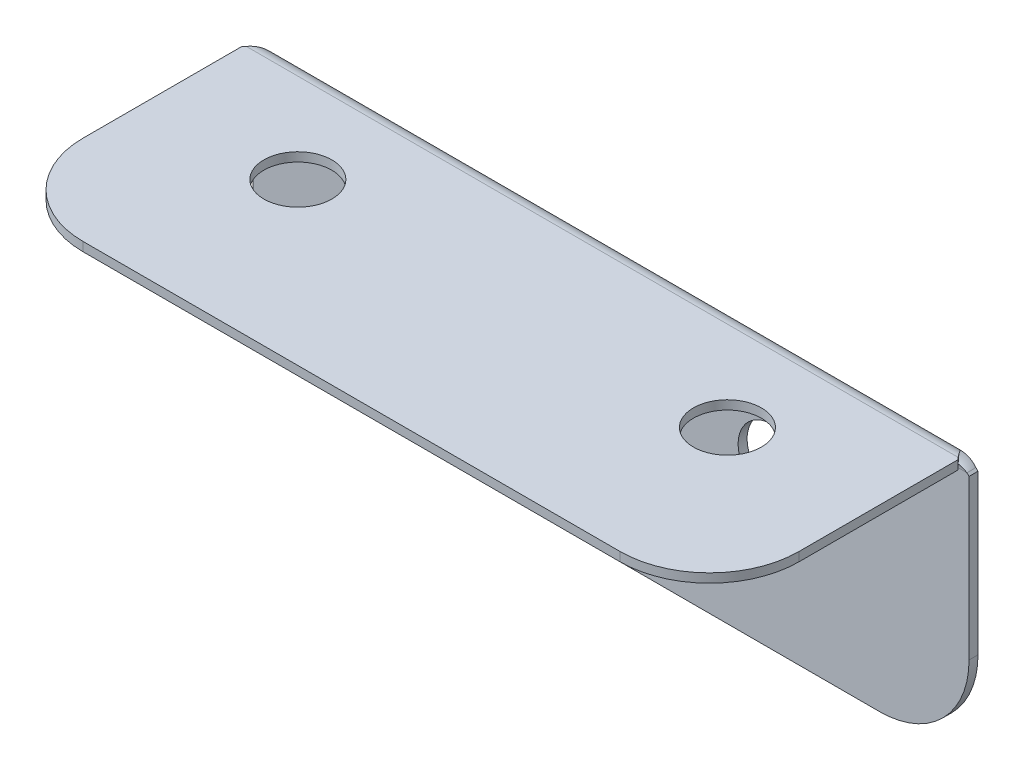
ISO-10303-21;
HEADER;
FILE_DESCRIPTION(('STEP AP214'),'2;1');
FILE_NAME('part.step','',(''),(''),'','','');
FILE_SCHEMA(('AUTOMOTIVE_DESIGN { 1 0 10303 214 1 1 1 1 }'));
ENDSEC;
DATA;
#1=APPLICATION_CONTEXT('core data for automotive mechanical design processes');
#2=APPLICATION_PROTOCOL_DEFINITION('international standard','automotive_design',2000,#1);
#3=PRODUCT_CONTEXT('',#1,'mechanical');
#4=PRODUCT('Part','Part','',(#3));
#5=PRODUCT_RELATED_PRODUCT_CATEGORY('part','',(#4));
#6=PRODUCT_DEFINITION_FORMATION('','',#4);
#7=PRODUCT_DEFINITION_CONTEXT('part definition',#1,'design');
#8=PRODUCT_DEFINITION('design','',#6,#7);
#9=PRODUCT_DEFINITION_SHAPE('','',#8);
#10=(LENGTH_UNIT() NAMED_UNIT(*) SI_UNIT(.MILLI.,.METRE.));
#11=(NAMED_UNIT(*) PLANE_ANGLE_UNIT() SI_UNIT($,.RADIAN.));
#12=(NAMED_UNIT(*) SI_UNIT($,.STERADIAN.) SOLID_ANGLE_UNIT());
#13=UNCERTAINTY_MEASURE_WITH_UNIT(LENGTH_MEASURE(1.E-05),#10,'distance_accuracy_value','');
#14=(GEOMETRIC_REPRESENTATION_CONTEXT(3) GLOBAL_UNCERTAINTY_ASSIGNED_CONTEXT((#13)) GLOBAL_UNIT_ASSIGNED_CONTEXT((#10,
#11,#12)) REPRESENTATION_CONTEXT('',''));
#15=CARTESIAN_POINT('',(0.,0.,0.));
#16=DIRECTION('',(0.,0.,1.));
#17=DIRECTION('',(1.,0.,0.));
#18=AXIS2_PLACEMENT_3D('',#15,#16,#17);
#19=CARTESIAN_POINT('',(20.,-0.500000000000006,-9.99999999999999));
#20=DIRECTION('',(1.,0.,0.));
#21=DIRECTION('',(0.,0.,-1.));
#22=AXIS2_PLACEMENT_3D('',#19,#20,#21);
#23=PLANE('',#22);
#24=DIRECTION('',(0.,-1.,0.));
#25=VECTOR('',#24,1.);
#26=CARTESIAN_POINT('',(20.,0.00100000000004263,-8.88194184136153));
#27=LINE('',#26,#25);
#28=CARTESIAN_POINT('',(20.,0.,-8.88194184136153));
#29=VERTEX_POINT('',#28);
#30=CARTESIAN_POINT('',(20.,-0.500000000000009,-8.88194184136153));
#31=VERTEX_POINT('',#30);
#32=EDGE_CURVE('E562',#29,#31,#27,.T.);
#33=ORIENTED_EDGE('',*,*,#32,.F.);
#34=DIRECTION('',(0.,0.,-1.));
#35=VECTOR('',#34,1.);
#36=CARTESIAN_POINT('',(20.,0.,-9.99999999999999));
#37=LINE('',#36,#35);
#38=CARTESIAN_POINT('',(20.,0.,0.));
#39=VERTEX_POINT('',#38);
#40=EDGE_CURVE('E581',#39,#29,#37,.T.);
#41=ORIENTED_EDGE('',*,*,#40,.F.);
#42=DIRECTION('',(0.,1.,0.));
#43=VECTOR('',#42,1.);
#44=CARTESIAN_POINT('',(20.,-0.500000000000006,0.));
#45=LINE('',#44,#43);
#46=CARTESIAN_POINT('',(20.,-0.500000000000006,0.));
#47=VERTEX_POINT('',#46);
#48=EDGE_CURVE('E609',#39,#47,#45,.F.);
#49=ORIENTED_EDGE('',*,*,#48,.T.);
#50=DIRECTION('',(0.,0.,-1.));
#51=VECTOR('',#50,1.);
#52=CARTESIAN_POINT('',(20.,-0.500000000000006,-9.99999999999999));
#53=LINE('',#52,#51);
#54=EDGE_CURVE('E584',#47,#31,#53,.T.);
#55=ORIENTED_EDGE('',*,*,#54,.T.);
#56=EDGE_LOOP('',(#33,#41,#49,#55));
#57=FACE_BOUND('',#56,.T.);
#58=ADVANCED_FACE('F84',(#57),#23,.T.);
#59=CARTESIAN_POINT('',(0.,-0.500000000000006,0.));
#60=DIRECTION('',(0.,1.,0.));
#61=DIRECTION('',(0.,0.,1.));
#62=AXIS2_PLACEMENT_3D('',#59,#60,#61);
#63=PLANE('',#62);
#64=CARTESIAN_POINT('',(12.,-0.500000000000006,-3.99999999999999));
#65=DIRECTION('',(0.,1.,0.));
#66=DIRECTION('',(0.,0.,1.));
#67=AXIS2_PLACEMENT_3D('',#64,#65,#66);
#68=CIRCLE('',#67,1.89864999999999);
#69=CARTESIAN_POINT('',(12.,-0.500000000000006,-2.10135));
#70=VERTEX_POINT('',#69);
#71=EDGE_CURVE('E568',#70,#70,#68,.T.);
#72=ORIENTED_EDGE('',*,*,#71,.T.);
#73=EDGE_LOOP('',(#72));
#74=FACE_BOUND('',#73,.T.);
#75=CARTESIAN_POINT('',(-12.,-0.500000000000006,-3.99999999999999));
#76=DIRECTION('',(0.,1.,0.));
#77=DIRECTION('',(0.,0.,1.));
#78=AXIS2_PLACEMENT_3D('',#75,#76,#77);
#79=CIRCLE('',#78,1.89864999999999);
#80=CARTESIAN_POINT('',(-12.,-0.500000000000006,-2.10135));
#81=VERTEX_POINT('',#80);
#82=EDGE_CURVE('E574',#81,#81,#79,.T.);
#83=ORIENTED_EDGE('',*,*,#82,.T.);
#84=EDGE_LOOP('',(#83));
#85=FACE_BOUND('',#84,.T.);
#86=DIRECTION('',(0.,0.,1.));
#87=VECTOR('',#86,1.);
#88=CARTESIAN_POINT('',(-20.,-0.500000000000006,-9.99999999999999));
#89=LINE('',#88,#87);
#90=CARTESIAN_POINT('',(-20.,-0.500000000000009,-8.88194184136153));
#91=VERTEX_POINT('',#90);
#92=CARTESIAN_POINT('',(-20.,-0.500000000000006,0.));
#93=VERTEX_POINT('',#92);
#94=EDGE_CURVE('E578',#91,#93,#89,.T.);
#95=ORIENTED_EDGE('',*,*,#94,.F.);
#96=DIRECTION('',(-0.70710678118655,0.,0.707106781186545));
#97=VECTOR('',#96,1.);
#98=CARTESIAN_POINT('',(-20.,-0.500000000000009,-8.88194184136153));
#99=LINE('',#98,#97);
#100=CARTESIAN_POINT('',(-19.8819418413615,-0.500000000000007,-9.));
#101=VERTEX_POINT('',#100);
#102=EDGE_CURVE('E561',#101,#91,#99,.T.);
#103=ORIENTED_EDGE('',*,*,#102,.F.);
#104=DIRECTION('',(-1.,0.,0.));
#105=VECTOR('',#104,1.);
#106=CARTESIAN_POINT('',(20.,-0.500000000000007,-8.99999999999999));
#107=LINE('',#106,#105);
#108=CARTESIAN_POINT('',(19.8819418413615,-0.500000000000001,-9.));
#109=VERTEX_POINT('',#108);
#110=EDGE_CURVE('E240',#109,#101,#107,.T.);
#111=ORIENTED_EDGE('',*,*,#110,.F.);
#112=DIRECTION('',(-0.707106781186546,0.,-0.707106781186549));
#113=VECTOR('',#112,1.);
#114=CARTESIAN_POINT('',(20.,-0.500000000000009,-8.88194184136153));
#115=LINE('',#114,#113);
#116=EDGE_CURVE('E564',#31,#109,#115,.T.);
#117=ORIENTED_EDGE('',*,*,#116,.F.);
#118=ORIENTED_EDGE('',*,*,#54,.F.);
#119=CARTESIAN_POINT('',(15.,-0.500000000000006,0.));
#120=DIRECTION('',(0.,1.,0.));
#121=DIRECTION('',(0.,0.,1.));
#122=AXIS2_PLACEMENT_3D('',#119,#120,#121);
#123=CIRCLE('',#122,5.);
#124=CARTESIAN_POINT('',(15.,-0.500000000000007,5.00000000000001));
#125=VERTEX_POINT('',#124);
#126=EDGE_CURVE('E604',#47,#125,#123,.F.);
#127=ORIENTED_EDGE('',*,*,#126,.T.);
#128=DIRECTION('',(1.,0.,0.));
#129=VECTOR('',#128,1.);
#130=CARTESIAN_POINT('',(-20.,-0.500000000000007,5.00000000000001));
#131=LINE('',#130,#129);
#132=CARTESIAN_POINT('',(-15.,-0.500000000000007,5.00000000000001));
#133=VERTEX_POINT('',#132);
#134=EDGE_CURVE('E580',#133,#125,#131,.T.);
#135=ORIENTED_EDGE('',*,*,#134,.F.);
#136=CARTESIAN_POINT('',(-15.,-0.500000000000006,0.));
#137=DIRECTION('',(0.,1.,0.));
#138=DIRECTION('',(0.,0.,1.));
#139=AXIS2_PLACEMENT_3D('',#136,#137,#138);
#140=CIRCLE('',#139,5.);
#141=EDGE_CURVE('E606',#133,#93,#140,.F.);
#142=ORIENTED_EDGE('',*,*,#141,.T.);
#143=EDGE_LOOP('',(#95,#103,#111,#117,#118,#127,#135,#142));
#144=FACE_BOUND('',#143,.T.);
#145=ADVANCED_FACE('F668',(#74,#85,#144),#63,.F.);
#146=CARTESIAN_POINT('',(0.,0.,0.));
#147=DIRECTION('',(0.,1.,0.));
#148=DIRECTION('',(0.,0.,1.));
#149=AXIS2_PLACEMENT_3D('',#146,#147,#148);
#150=PLANE('',#149);
#151=DIRECTION('',(-0.70710678118655,0.,0.707106781186545));
#152=VECTOR('',#151,1.);
#153=CARTESIAN_POINT('',(-20.,0.,-8.88194184136153));
#154=LINE('',#153,#152);
#155=CARTESIAN_POINT('',(-19.8819418413615,0.,-8.99999999999999));
#156=VERTEX_POINT('',#155);
#157=CARTESIAN_POINT('',(-20.,0.,-8.88194184136153));
#158=VERTEX_POINT('',#157);
#159=EDGE_CURVE('E109',#156,#158,#154,.T.);
#160=ORIENTED_EDGE('',*,*,#159,.T.);
#161=DIRECTION('',(0.,0.,1.));
#162=VECTOR('',#161,1.);
#163=CARTESIAN_POINT('',(-20.,0.,-9.99999999999999));
#164=LINE('',#163,#162);
#165=CARTESIAN_POINT('',(-20.,0.,0.));
#166=VERTEX_POINT('',#165);
#167=EDGE_CURVE('E577',#158,#166,#164,.T.);
#168=ORIENTED_EDGE('',*,*,#167,.T.);
#169=CARTESIAN_POINT('',(-15.,0.,0.));
#170=DIRECTION('',(0.,1.,0.));
#171=DIRECTION('',(0.,0.,1.));
#172=AXIS2_PLACEMENT_3D('',#169,#170,#171);
#173=CIRCLE('',#172,5.);
#174=CARTESIAN_POINT('',(-15.,0.,5.00000000000001));
#175=VERTEX_POINT('',#174);
#176=EDGE_CURVE('E597',#166,#175,#173,.T.);
#177=ORIENTED_EDGE('',*,*,#176,.T.);
#178=DIRECTION('',(1.,0.,0.));
#179=VECTOR('',#178,1.);
#180=CARTESIAN_POINT('',(-20.,0.,5.00000000000001));
#181=LINE('',#180,#179);
#182=CARTESIAN_POINT('',(15.,0.,5.00000000000001));
#183=VERTEX_POINT('',#182);
#184=EDGE_CURVE('E589',#175,#183,#181,.T.);
#185=ORIENTED_EDGE('',*,*,#184,.T.);
#186=CARTESIAN_POINT('',(15.,0.,0.));
#187=DIRECTION('',(0.,1.,0.));
#188=DIRECTION('',(0.,0.,1.));
#189=AXIS2_PLACEMENT_3D('',#186,#187,#188);
#190=CIRCLE('',#189,5.);
#191=EDGE_CURVE('E595',#183,#39,#190,.T.);
#192=ORIENTED_EDGE('',*,*,#191,.T.);
#193=ORIENTED_EDGE('',*,*,#40,.T.);
#194=DIRECTION('',(-0.707106781186546,0.,-0.707106781186549));
#195=VECTOR('',#194,1.);
#196=CARTESIAN_POINT('',(20.,0.,-8.88194184136153));
#197=LINE('',#196,#195);
#198=CARTESIAN_POINT('',(19.8819418413615,0.,-8.99999999999999));
#199=VERTEX_POINT('',#198);
#200=EDGE_CURVE('E101',#29,#199,#197,.T.);
#201=ORIENTED_EDGE('',*,*,#200,.T.);
#202=DIRECTION('',(-1.,0.,0.));
#203=VECTOR('',#202,1.);
#204=CARTESIAN_POINT('',(20.,0.,-8.99999999999999));
#205=LINE('',#204,#203);
#206=EDGE_CURVE('E94',#199,#156,#205,.T.);
#207=ORIENTED_EDGE('',*,*,#206,.T.);
#208=EDGE_LOOP('',(#160,#168,#177,#185,#192,#193,#201,#207));
#209=FACE_BOUND('',#208,.T.);
#210=CARTESIAN_POINT('',(12.,0.,-3.99999999999999));
#211=DIRECTION('',(0.,1.,0.));
#212=DIRECTION('',(0.,0.,1.));
#213=AXIS2_PLACEMENT_3D('',#210,#211,#212);
#214=CIRCLE('',#213,1.89864999999999);
#215=CARTESIAN_POINT('',(12.,0.,-2.10135000000001));
#216=VERTEX_POINT('',#215);
#217=EDGE_CURVE('E565',#216,#216,#214,.T.);
#218=ORIENTED_EDGE('',*,*,#217,.F.);
#219=EDGE_LOOP('',(#218));
#220=FACE_BOUND('',#219,.T.);
#221=CARTESIAN_POINT('',(-12.,0.,-3.99999999999999));
#222=DIRECTION('',(0.,1.,0.));
#223=DIRECTION('',(0.,0.,1.));
#224=AXIS2_PLACEMENT_3D('',#221,#222,#223);
#225=CIRCLE('',#224,1.89864999999999);
#226=CARTESIAN_POINT('',(-12.,0.,-2.10135000000001));
#227=VERTEX_POINT('',#226);
#228=EDGE_CURVE('E571',#227,#227,#225,.T.);
#229=ORIENTED_EDGE('',*,*,#228,.F.);
#230=EDGE_LOOP('',(#229));
#231=FACE_BOUND('',#230,.T.);
#232=ADVANCED_FACE('F660',(#209,#220,#231),#150,.T.);
#233=CARTESIAN_POINT('',(-20.,-0.500000000000006,-9.99999999999999));
#234=DIRECTION('',(-1.,0.,0.));
#235=DIRECTION('',(0.,0.,1.));
#236=AXIS2_PLACEMENT_3D('',#233,#234,#235);
#237=PLANE('',#236);
#238=DIRECTION('',(0.,-1.,0.));
#239=VECTOR('',#238,1.);
#240=CARTESIAN_POINT('',(-20.,0.00100000000004263,-8.88194184136153));
#241=LINE('',#240,#239);
#242=EDGE_CURVE('E558',#158,#91,#241,.T.);
#243=ORIENTED_EDGE('',*,*,#242,.T.);
#244=ORIENTED_EDGE('',*,*,#94,.T.);
#245=DIRECTION('',(0.,1.,0.));
#246=VECTOR('',#245,1.);
#247=CARTESIAN_POINT('',(-20.,-0.500000000000006,0.));
#248=LINE('',#247,#246);
#249=EDGE_CURVE('E587',#93,#166,#248,.T.);
#250=ORIENTED_EDGE('',*,*,#249,.T.);
#251=ORIENTED_EDGE('',*,*,#167,.F.);
#252=EDGE_LOOP('',(#243,#244,#250,#251));
#253=FACE_BOUND('',#252,.T.);
#254=ADVANCED_FACE('F656',(#253),#237,.T.);
#255=CARTESIAN_POINT('',(-20.,-0.500000000000007,5.00000000000001));
#256=DIRECTION('',(0.,0.,1.));
#257=DIRECTION('',(1.,0.,0.));
#258=AXIS2_PLACEMENT_3D('',#255,#256,#257);
#259=PLANE('',#258);
#260=ORIENTED_EDGE('',*,*,#184,.F.);
#261=DIRECTION('',(0.,1.,0.));
#262=VECTOR('',#261,1.);
#263=CARTESIAN_POINT('',(-15.,-0.500000000000007,5.00000000000001));
#264=LINE('',#263,#262);
#265=EDGE_CURVE('E602',#175,#133,#264,.F.);
#266=ORIENTED_EDGE('',*,*,#265,.T.);
#267=ORIENTED_EDGE('',*,*,#134,.T.);
#268=DIRECTION('',(0.,1.,0.));
#269=VECTOR('',#268,1.);
#270=CARTESIAN_POINT('',(15.,-0.500000000000007,5.00000000000001));
#271=LINE('',#270,#269);
#272=EDGE_CURVE('E599',#125,#183,#271,.T.);
#273=ORIENTED_EDGE('',*,*,#272,.T.);
#274=EDGE_LOOP('',(#260,#266,#267,#273));
#275=FACE_BOUND('',#274,.T.);
#276=ADVANCED_FACE('F659',(#275),#259,.T.);
#277=CARTESIAN_POINT('',(-12.,0.,-3.99999999999999));
#278=DIRECTION('',(0.,1.,0.));
#279=DIRECTION('',(0.,0.,1.));
#280=AXIS2_PLACEMENT_3D('',#277,#278,#279);
#281=CYLINDRICAL_SURFACE('',#280,1.89864999999999);
#282=ORIENTED_EDGE('',*,*,#82,.F.);
#283=EDGE_LOOP('',(#282));
#284=FACE_BOUND('',#283,.T.);
#285=ORIENTED_EDGE('',*,*,#228,.T.);
#286=EDGE_LOOP('',(#285));
#287=FACE_BOUND('',#286,.T.);
#288=ADVANCED_FACE('F664',(#284,#287),#281,.F.);
#289=CARTESIAN_POINT('',(12.,0.,-3.99999999999999));
#290=DIRECTION('',(0.,1.,0.));
#291=DIRECTION('',(0.,0.,1.));
#292=AXIS2_PLACEMENT_3D('',#289,#290,#291);
#293=CYLINDRICAL_SURFACE('',#292,1.89864999999999);
#294=ORIENTED_EDGE('',*,*,#71,.F.);
#295=EDGE_LOOP('',(#294));
#296=FACE_BOUND('',#295,.T.);
#297=ORIENTED_EDGE('',*,*,#217,.T.);
#298=EDGE_LOOP('',(#297));
#299=FACE_BOUND('',#298,.T.);
#300=ADVANCED_FACE('F542',(#296,#299),#293,.F.);
#301=CARTESIAN_POINT('',(-15.,-0.500000000000006,0.));
#302=DIRECTION('',(0.,1.,0.));
#303=DIRECTION('',(0.,0.,1.));
#304=AXIS2_PLACEMENT_3D('',#301,#302,#303);
#305=CYLINDRICAL_SURFACE('',#304,5.);
#306=ORIENTED_EDGE('',*,*,#141,.F.);
#307=ORIENTED_EDGE('',*,*,#265,.F.);
#308=ORIENTED_EDGE('',*,*,#176,.F.);
#309=ORIENTED_EDGE('',*,*,#249,.F.);
#310=EDGE_LOOP('',(#306,#307,#308,#309));
#311=FACE_BOUND('',#310,.T.);
#312=ADVANCED_FACE('F651',(#311),#305,.T.);
#313=CARTESIAN_POINT('',(15.,-0.500000000000006,0.));
#314=DIRECTION('',(0.,1.,0.));
#315=DIRECTION('',(0.,0.,1.));
#316=AXIS2_PLACEMENT_3D('',#313,#314,#315);
#317=CYLINDRICAL_SURFACE('',#316,5.);
#318=ORIENTED_EDGE('',*,*,#126,.F.);
#319=ORIENTED_EDGE('',*,*,#48,.F.);
#320=ORIENTED_EDGE('',*,*,#191,.F.);
#321=ORIENTED_EDGE('',*,*,#272,.F.);
#322=EDGE_LOOP('',(#318,#319,#320,#321));
#323=FACE_BOUND('',#322,.T.);
#324=ADVANCED_FACE('F648',(#323),#317,.T.);
#325=CARTESIAN_POINT('',(20.,0.00100000000004263,-8.88194184136153));
#326=DIRECTION('',(-0.707106781186549,0.,0.707106781186546));
#327=DIRECTION('',(-0.707106781186546,0.,-0.707106781186549));
#328=AXIS2_PLACEMENT_3D('',#325,#326,#327);
#329=PLANE('',#328);
#330=CARTESIAN_POINT('',(19.8819418413615,0.,-9.));
#331=CARTESIAN_POINT('',(19.8819418413615,-0.500000000000001,-9.));
#332=B_SPLINE_CURVE_WITH_KNOTS('',1,(#330,#331),.UNSPECIFIED.,.F.,.F.,(2,2),(0.,1.),.UNSPECIFIED.);
#333=EDGE_CURVE('E13',#199,#109,#332,.T.);
#334=ORIENTED_EDGE('',*,*,#333,.F.);
#335=ORIENTED_EDGE('',*,*,#200,.F.);
#336=ORIENTED_EDGE('',*,*,#32,.T.);
#337=ORIENTED_EDGE('',*,*,#116,.T.);
#338=EDGE_LOOP('',(#334,#335,#336,#337));
#339=FACE_BOUND('',#338,.T.);
#340=ADVANCED_FACE('F86',(#339),#329,.F.);
#341=CARTESIAN_POINT('',(-20.,0.00100000000004263,-8.88194184136153));
#342=DIRECTION('',(0.707106781186545,0.,0.70710678118655));
#343=DIRECTION('',(-0.70710678118655,0.,0.707106781186545));
#344=AXIS2_PLACEMENT_3D('',#341,#342,#343);
#345=PLANE('',#344);
#346=CARTESIAN_POINT('',(-19.8819418413615,-0.500000000000001,-9.));
#347=CARTESIAN_POINT('',(-19.8819418413615,0.,-9.00000000000001));
#348=B_SPLINE_CURVE_WITH_KNOTS('',1,(#346,#347),.UNSPECIFIED.,.F.,.F.,(2,2),(0.,1.),.UNSPECIFIED.);
#349=EDGE_CURVE('E612',#101,#156,#348,.T.);
#350=ORIENTED_EDGE('',*,*,#349,.F.);
#351=ORIENTED_EDGE('',*,*,#102,.T.);
#352=ORIENTED_EDGE('',*,*,#242,.F.);
#353=ORIENTED_EDGE('',*,*,#159,.F.);
#354=EDGE_LOOP('',(#350,#351,#352,#353));
#355=FACE_BOUND('',#354,.T.);
#356=ADVANCED_FACE('F638',(#355),#345,.F.);
#357=CARTESIAN_POINT('',(20.,-0.499999999999998,-10.));
#358=DIRECTION('',(1.,0.,0.));
#359=DIRECTION('',(0.,0.,-1.));
#360=AXIS2_PLACEMENT_3D('',#357,#358,#359);
#361=PLANE('',#360);
#362=DIRECTION('',(0.,0.,1.));
#363=VECTOR('',#362,1.);
#364=CARTESIAN_POINT('',(20.,-1.11805815863846,-10.001));
#365=LINE('',#364,#363);
#366=CARTESIAN_POINT('',(20.,-1.11805815863846,-10.));
#367=VERTEX_POINT('',#366);
#368=CARTESIAN_POINT('',(20.,-1.11805815863846,-9.5));
#369=VERTEX_POINT('',#368);
#370=EDGE_CURVE('E501',#367,#369,#365,.T.);
#371=ORIENTED_EDGE('',*,*,#370,.T.);
#372=DIRECTION('',(0.,-1.,0.));
#373=VECTOR('',#372,1.);
#374=CARTESIAN_POINT('',(20.,0.,-9.5));
#375=LINE('',#374,#373);
#376=CARTESIAN_POINT('',(20.,-10.,-9.50000000000003));
#377=VERTEX_POINT('',#376);
#378=EDGE_CURVE('E459',#377,#369,#375,.F.);
#379=ORIENTED_EDGE('',*,*,#378,.F.);
#380=DIRECTION('',(0.,0.,1.));
#381=VECTOR('',#380,1.);
#382=CARTESIAN_POINT('',(20.,-10.,-10.));
#383=LINE('',#382,#381);
#384=CARTESIAN_POINT('',(20.,-10.,-10.));
#385=VERTEX_POINT('',#384);
#386=EDGE_CURVE('E499',#377,#385,#383,.F.);
#387=ORIENTED_EDGE('',*,*,#386,.T.);
#388=DIRECTION('',(0.,1.,0.));
#389=VECTOR('',#388,1.);
#390=CARTESIAN_POINT('',(20.,-0.499999999999998,-10.));
#391=LINE('',#390,#389);
#392=EDGE_CURVE('E496',#385,#367,#391,.T.);
#393=ORIENTED_EDGE('',*,*,#392,.T.);
#394=EDGE_LOOP('',(#371,#379,#387,#393));
#395=FACE_BOUND('',#394,.T.);
#396=ADVANCED_FACE('F647',(#395),#361,.T.);
#397=CARTESIAN_POINT('',(15.,-10.,-10.));
#398=DIRECTION('',(0.,0.,1.));
#399=DIRECTION('',(0.,-1.,0.));
#400=AXIS2_PLACEMENT_3D('',#397,#398,#399);
#401=CYLINDRICAL_SURFACE('',#400,5.);
#402=CARTESIAN_POINT('',(15.,-10.,-10.));
#403=DIRECTION('',(0.,0.,-1.));
#404=DIRECTION('',(0.,1.,0.));
#405=AXIS2_PLACEMENT_3D('',#402,#403,#404);
#406=CIRCLE('',#405,5.);
#407=CARTESIAN_POINT('',(15.,-15.,-10.));
#408=VERTEX_POINT('',#407);
#409=EDGE_CURVE('E453',#385,#408,#406,.T.);
#410=ORIENTED_EDGE('',*,*,#409,.F.);
#411=ORIENTED_EDGE('',*,*,#386,.F.);
#412=CARTESIAN_POINT('',(15.,-10.,-9.50000000000003));
#413=DIRECTION('',(0.,0.,-1.));
#414=DIRECTION('',(0.,1.,0.));
#415=AXIS2_PLACEMENT_3D('',#412,#413,#414);
#416=CIRCLE('',#415,5.);
#417=CARTESIAN_POINT('',(15.,-15.,-9.50000000000005));
#418=VERTEX_POINT('',#417);
#419=EDGE_CURVE('E462',#418,#377,#416,.F.);
#420=ORIENTED_EDGE('',*,*,#419,.F.);
#421=DIRECTION('',(0.,0.,1.));
#422=VECTOR('',#421,1.);
#423=CARTESIAN_POINT('',(15.,-15.,-10.));
#424=LINE('',#423,#422);
#425=EDGE_CURVE('E490',#408,#418,#424,.T.);
#426=ORIENTED_EDGE('',*,*,#425,.F.);
#427=EDGE_LOOP('',(#410,#411,#420,#426));
#428=FACE_BOUND('',#427,.T.);
#429=ADVANCED_FACE('F757',(#428),#401,.T.);
#430=CARTESIAN_POINT('',(20.,-15.,-10.));
#431=DIRECTION('',(0.,-1.,0.));
#432=DIRECTION('',(0.,0.,-1.));
#433=AXIS2_PLACEMENT_3D('',#430,#431,#432);
#434=PLANE('',#433);
#435=DIRECTION('',(1.,0.,0.));
#436=VECTOR('',#435,1.);
#437=CARTESIAN_POINT('',(20.,-15.,-10.));
#438=LINE('',#437,#436);
#439=CARTESIAN_POINT('',(-15.,-15.,-10.));
#440=VERTEX_POINT('',#439);
#441=EDGE_CURVE('E493',#440,#408,#438,.T.);
#442=ORIENTED_EDGE('',*,*,#441,.T.);
#443=ORIENTED_EDGE('',*,*,#425,.T.);
#444=DIRECTION('',(-1.,0.,0.));
#445=VECTOR('',#444,1.);
#446=CARTESIAN_POINT('',(0.,-15.,-9.50000000000005));
#447=LINE('',#446,#445);
#448=CARTESIAN_POINT('',(-15.,-15.,-9.50000000000005));
#449=VERTEX_POINT('',#448);
#450=EDGE_CURVE('E464',#449,#418,#447,.F.);
#451=ORIENTED_EDGE('',*,*,#450,.F.);
#452=DIRECTION('',(0.,0.,1.));
#453=VECTOR('',#452,1.);
#454=CARTESIAN_POINT('',(-15.,-15.,-10.));
#455=LINE('',#454,#453);
#456=EDGE_CURVE('E488',#449,#440,#455,.F.);
#457=ORIENTED_EDGE('',*,*,#456,.T.);
#458=EDGE_LOOP('',(#442,#443,#451,#457));
#459=FACE_BOUND('',#458,.T.);
#460=ADVANCED_FACE('F751',(#459),#434,.T.);
#461=CARTESIAN_POINT('',(-15.,-10.,-10.));
#462=DIRECTION('',(0.,0.,1.));
#463=DIRECTION('',(0.,-1.,0.));
#464=AXIS2_PLACEMENT_3D('',#461,#462,#463);
#465=CYLINDRICAL_SURFACE('',#464,5.);
#466=CARTESIAN_POINT('',(-15.,-10.,-10.));
#467=DIRECTION('',(0.,0.,-1.));
#468=DIRECTION('',(0.,1.,0.));
#469=AXIS2_PLACEMENT_3D('',#466,#467,#468);
#470=CIRCLE('',#469,5.);
#471=CARTESIAN_POINT('',(-20.,-10.,-10.));
#472=VERTEX_POINT('',#471);
#473=EDGE_CURVE('E444',#440,#472,#470,.T.);
#474=ORIENTED_EDGE('',*,*,#473,.F.);
#475=ORIENTED_EDGE('',*,*,#456,.F.);
#476=CARTESIAN_POINT('',(-15.,-10.,-9.50000000000003));
#477=DIRECTION('',(0.,0.,-1.));
#478=DIRECTION('',(0.,1.,0.));
#479=AXIS2_PLACEMENT_3D('',#476,#477,#478);
#480=CIRCLE('',#479,5.);
#481=CARTESIAN_POINT('',(-20.,-10.,-9.50000000000003));
#482=VERTEX_POINT('',#481);
#483=EDGE_CURVE('E467',#482,#449,#480,.F.);
#484=ORIENTED_EDGE('',*,*,#483,.F.);
#485=DIRECTION('',(0.,0.,1.));
#486=VECTOR('',#485,1.);
#487=CARTESIAN_POINT('',(-20.,-10.,-10.));
#488=LINE('',#487,#486);
#489=EDGE_CURVE('E483',#472,#482,#488,.T.);
#490=ORIENTED_EDGE('',*,*,#489,.F.);
#491=EDGE_LOOP('',(#474,#475,#484,#490));
#492=FACE_BOUND('',#491,.T.);
#493=ADVANCED_FACE('F748',(#492),#465,.T.);
#494=CARTESIAN_POINT('',(-20.,-15.,-10.));
#495=DIRECTION('',(-1.,0.,0.));
#496=DIRECTION('',(0.,0.,1.));
#497=AXIS2_PLACEMENT_3D('',#494,#495,#496);
#498=PLANE('',#497);
#499=DIRECTION('',(0.,0.,1.));
#500=VECTOR('',#499,1.);
#501=CARTESIAN_POINT('',(-20.,-1.11805815863847,-10.001));
#502=LINE('',#501,#500);
#503=CARTESIAN_POINT('',(-20.,-1.11805815863847,-10.));
#504=VERTEX_POINT('',#503);
#505=CARTESIAN_POINT('',(-20.,-1.11805815863847,-9.5));
#506=VERTEX_POINT('',#505);
#507=EDGE_CURVE('E456',#504,#506,#502,.T.);
#508=ORIENTED_EDGE('',*,*,#507,.F.);
#509=DIRECTION('',(0.,-1.,0.));
#510=VECTOR('',#509,1.);
#511=CARTESIAN_POINT('',(-20.,-15.,-10.));
#512=LINE('',#511,#510);
#513=EDGE_CURVE('E486',#504,#472,#512,.T.);
#514=ORIENTED_EDGE('',*,*,#513,.T.);
#515=ORIENTED_EDGE('',*,*,#489,.T.);
#516=DIRECTION('',(0.,1.,0.));
#517=VECTOR('',#516,1.);
#518=CARTESIAN_POINT('',(-20.,0.,-9.5));
#519=LINE('',#518,#517);
#520=EDGE_CURVE('E469',#506,#482,#519,.F.);
#521=ORIENTED_EDGE('',*,*,#520,.F.);
#522=EDGE_LOOP('',(#508,#514,#515,#521));
#523=FACE_BOUND('',#522,.T.);
#524=ADVANCED_FACE('F740',(#523),#498,.T.);
#525=CARTESIAN_POINT('',(9.,-6.,-9.5));
#526=DIRECTION('',(0.,0.,1.));
#527=DIRECTION('',(1.,0.,0.));
#528=AXIS2_PLACEMENT_3D('',#525,#526,#527);
#529=CYLINDRICAL_SURFACE('',#528,1.89864999999999);
#530=CARTESIAN_POINT('',(9.,-6.,-10.));
#531=DIRECTION('',(0.,0.,-1.));
#532=DIRECTION('',(0.,1.,0.));
#533=AXIS2_PLACEMENT_3D('',#530,#531,#532);
#534=CIRCLE('',#533,1.89864999999999);
#535=CARTESIAN_POINT('',(9.,-4.10135000000001,-10.));
#536=VERTEX_POINT('',#535);
#537=EDGE_CURVE('E480',#536,#536,#534,.T.);
#538=ORIENTED_EDGE('',*,*,#537,.T.);
#539=EDGE_LOOP('',(#538));
#540=FACE_BOUND('',#539,.T.);
#541=CARTESIAN_POINT('',(9.,-6.,-9.5));
#542=DIRECTION('',(0.,0.,1.));
#543=DIRECTION('',(1.,0.,0.));
#544=AXIS2_PLACEMENT_3D('',#541,#542,#543);
#545=CIRCLE('',#544,1.89864999999999);
#546=CARTESIAN_POINT('',(10.89865,-6.,-9.5));
#547=VERTEX_POINT('',#546);
#548=EDGE_CURVE('E477',#547,#547,#545,.T.);
#549=ORIENTED_EDGE('',*,*,#548,.T.);
#550=EDGE_LOOP('',(#549));
#551=FACE_BOUND('',#550,.T.);
#552=ADVANCED_FACE('F772',(#540,#551),#529,.F.);
#553=CARTESIAN_POINT('',(-9.,-6.,-9.5));
#554=DIRECTION('',(0.,0.,1.));
#555=DIRECTION('',(1.,0.,0.));
#556=AXIS2_PLACEMENT_3D('',#553,#554,#555);
#557=CYLINDRICAL_SURFACE('',#556,1.89864999999999);
#558=CARTESIAN_POINT('',(-9.,-6.,-10.));
#559=DIRECTION('',(0.,0.,-1.));
#560=DIRECTION('',(0.,1.,0.));
#561=AXIS2_PLACEMENT_3D('',#558,#559,#560);
#562=CIRCLE('',#561,1.89864999999999);
#563=CARTESIAN_POINT('',(-9.,-4.10135000000001,-10.));
#564=VERTEX_POINT('',#563);
#565=EDGE_CURVE('E474',#564,#564,#562,.T.);
#566=ORIENTED_EDGE('',*,*,#565,.T.);
#567=EDGE_LOOP('',(#566));
#568=FACE_BOUND('',#567,.T.);
#569=CARTESIAN_POINT('',(-9.,-6.,-9.5));
#570=DIRECTION('',(0.,0.,1.));
#571=DIRECTION('',(1.,0.,0.));
#572=AXIS2_PLACEMENT_3D('',#569,#570,#571);
#573=CIRCLE('',#572,1.89864999999999);
#574=CARTESIAN_POINT('',(-7.10135000000001,-6.,-9.5));
#575=VERTEX_POINT('',#574);
#576=EDGE_CURVE('E471',#575,#575,#573,.T.);
#577=ORIENTED_EDGE('',*,*,#576,.T.);
#578=EDGE_LOOP('',(#577));
#579=FACE_BOUND('',#578,.T.);
#580=ADVANCED_FACE('F774',(#568,#579),#557,.F.);
#581=CARTESIAN_POINT('',(0.,0.,-9.5));
#582=DIRECTION('',(0.,0.,-1.));
#583=DIRECTION('',(0.,1.,0.));
#584=AXIS2_PLACEMENT_3D('',#581,#582,#583);
#585=PLANE('',#584);
#586=ORIENTED_EDGE('',*,*,#576,.F.);
#587=EDGE_LOOP('',(#586));
#588=FACE_BOUND('',#587,.T.);
#589=ORIENTED_EDGE('',*,*,#548,.F.);
#590=EDGE_LOOP('',(#589));
#591=FACE_BOUND('',#590,.T.);
#592=DIRECTION('',(1.,0.,0.));
#593=VECTOR('',#592,1.);
#594=CARTESIAN_POINT('',(-20.,-0.999999999999999,-9.5));
#595=LINE('',#594,#593);
#596=CARTESIAN_POINT('',(-19.8819418413615,-0.999999999999999,-9.5));
#597=VERTEX_POINT('',#596);
#598=CARTESIAN_POINT('',(19.8819418413615,-1.,-9.5));
#599=VERTEX_POINT('',#598);
#600=EDGE_CURVE('E228',#597,#599,#595,.T.);
#601=ORIENTED_EDGE('',*,*,#600,.F.);
#602=DIRECTION('',(0.707106781186545,0.70710678118655,0.));
#603=VECTOR('',#602,1.);
#604=CARTESIAN_POINT('',(-19.2928932188135,-0.410951377451916,-9.5));
#605=LINE('',#604,#603);
#606=EDGE_CURVE('E458',#506,#597,#605,.T.);
#607=ORIENTED_EDGE('',*,*,#606,.F.);
#608=ORIENTED_EDGE('',*,*,#520,.T.);
#609=ORIENTED_EDGE('',*,*,#483,.T.);
#610=ORIENTED_EDGE('',*,*,#450,.T.);
#611=ORIENTED_EDGE('',*,*,#419,.T.);
#612=ORIENTED_EDGE('',*,*,#378,.T.);
#613=DIRECTION('',(0.707106781186545,-0.70710678118655,0.));
#614=VECTOR('',#613,1.);
#615=CARTESIAN_POINT('',(19.2928932188135,-0.410951377451911,-9.5));
#616=LINE('',#615,#614);
#617=EDGE_CURVE('E452',#599,#369,#616,.T.);
#618=ORIENTED_EDGE('',*,*,#617,.F.);
#619=EDGE_LOOP('',(#601,#607,#608,#609,#610,#611,#612,#618));
#620=FACE_BOUND('',#619,.T.);
#621=ADVANCED_FACE('F532',(#588,#591,#620),#585,.F.);
#622=CARTESIAN_POINT('',(-19.2928932188135,-0.410951377451916,-10.001));
#623=DIRECTION('',(0.70710678118655,-0.707106781186545,0.));
#624=DIRECTION('',(0.707106781186545,0.70710678118655,0.));
#625=AXIS2_PLACEMENT_3D('',#622,#623,#624);
#626=PLANE('',#625);
#627=CARTESIAN_POINT('',(-19.8819418413615,-0.999999999999998,-10.));
#628=CARTESIAN_POINT('',(-19.8819418413615,-0.999999999999999,-9.5));
#629=B_SPLINE_CURVE_WITH_KNOTS('',1,(#627,#628),.UNSPECIFIED.,.F.,.F.,(2,2),(0.,1.),.UNSPECIFIED.);
#630=CARTESIAN_POINT('',(-19.8819418413615,-0.999999999999995,-10.));
#631=VERTEX_POINT('',#630);
#632=EDGE_CURVE('E250',#631,#597,#629,.T.);
#633=ORIENTED_EDGE('',*,*,#632,.F.);
#634=DIRECTION('',(0.707106781186545,0.70710678118655,0.));
#635=VECTOR('',#634,1.);
#636=CARTESIAN_POINT('',(-19.2928932188135,-0.410951377451916,-10.));
#637=LINE('',#636,#635);
#638=EDGE_CURVE('E509',#504,#631,#637,.T.);
#639=ORIENTED_EDGE('',*,*,#638,.F.);
#640=ORIENTED_EDGE('',*,*,#507,.T.);
#641=ORIENTED_EDGE('',*,*,#606,.T.);
#642=EDGE_LOOP('',(#633,#639,#640,#641));
#643=FACE_BOUND('',#642,.T.);
#644=ADVANCED_FACE('F521',(#643),#626,.F.);
#645=CARTESIAN_POINT('',(0.,0.,-10.));
#646=DIRECTION('',(0.,0.,-1.));
#647=DIRECTION('',(0.,1.,0.));
#648=AXIS2_PLACEMENT_3D('',#645,#646,#647);
#649=PLANE('',#648);
#650=ORIENTED_EDGE('',*,*,#638,.T.);
#651=DIRECTION('',(1.,0.,0.));
#652=VECTOR('',#651,1.);
#653=CARTESIAN_POINT('',(0.,-0.999999999999996,-10.));
#654=LINE('',#653,#652);
#655=CARTESIAN_POINT('',(19.8819418413615,-0.999999999999999,-10.));
#656=VERTEX_POINT('',#655);
#657=EDGE_CURVE('E519',#631,#656,#654,.T.);
#658=ORIENTED_EDGE('',*,*,#657,.T.);
#659=DIRECTION('',(0.707106781186545,-0.70710678118655,0.));
#660=VECTOR('',#659,1.);
#661=CARTESIAN_POINT('',(19.2928932188135,-0.410951377451911,-10.));
#662=LINE('',#661,#660);
#663=EDGE_CURVE('E455',#656,#367,#662,.T.);
#664=ORIENTED_EDGE('',*,*,#663,.T.);
#665=ORIENTED_EDGE('',*,*,#392,.F.);
#666=ORIENTED_EDGE('',*,*,#409,.T.);
#667=ORIENTED_EDGE('',*,*,#441,.F.);
#668=ORIENTED_EDGE('',*,*,#473,.T.);
#669=ORIENTED_EDGE('',*,*,#513,.F.);
#670=EDGE_LOOP('',(#650,#658,#664,#665,#666,#667,#668,#669));
#671=FACE_BOUND('',#670,.T.);
#672=ORIENTED_EDGE('',*,*,#565,.F.);
#673=EDGE_LOOP('',(#672));
#674=FACE_BOUND('',#673,.T.);
#675=ORIENTED_EDGE('',*,*,#537,.F.);
#676=EDGE_LOOP('',(#675));
#677=FACE_BOUND('',#676,.T.);
#678=ADVANCED_FACE('F531',(#671,#674,#677),#649,.T.);
#679=CARTESIAN_POINT('',(19.2928932188135,-0.410951377451911,-10.001));
#680=DIRECTION('',(-0.70710678118655,-0.707106781186545,0.));
#681=DIRECTION('',(0.707106781186545,-0.70710678118655,0.));
#682=AXIS2_PLACEMENT_3D('',#679,#680,#681);
#683=PLANE('',#682);
#684=CARTESIAN_POINT('',(19.8819418413615,-1.,-9.5));
#685=CARTESIAN_POINT('',(19.8819418413615,-1.,-10.));
#686=B_SPLINE_CURVE_WITH_KNOTS('',1,(#684,#685),.UNSPECIFIED.,.F.,.F.,(2,2),(0.,1.),.UNSPECIFIED.);
#687=EDGE_CURVE('E317',#599,#656,#686,.T.);
#688=ORIENTED_EDGE('',*,*,#687,.F.);
#689=ORIENTED_EDGE('',*,*,#617,.T.);
#690=ORIENTED_EDGE('',*,*,#370,.F.);
#691=ORIENTED_EDGE('',*,*,#663,.F.);
#692=EDGE_LOOP('',(#688,#689,#690,#691));
#693=FACE_BOUND('',#692,.T.);
#694=ADVANCED_FACE('F536',(#693),#683,.F.);
#695=CARTESIAN_POINT('',(-19.8819418413615,0.,-9.00000000000001));
#696=CARTESIAN_POINT('',(-19.7837557425248,0.,-9.13091479844894));
#697=CARTESIAN_POINT('',(-19.6855923005122,-0.0260273233316858,-9.26174788435928));
#698=CARTESIAN_POINT('',(-19.4892427596628,-0.126213611645743,-9.5036189803709));
#699=CARTESIAN_POINT('',(-19.3910793176502,-0.200322477072541,-9.61453603944564));
#700=CARTESIAN_POINT('',(-19.2928932188135,-0.292893218813451,-9.70710678118655));
#701=CARTESIAN_POINT('',(-19.8819418413615,-0.500000000000001,-9.));
#702=CARTESIAN_POINT('',(-19.7837616245849,-0.500000000000001,-9.06545347785108));
#703=CARTESIAN_POINT('',(-19.6855923005122,-0.513013661665843,-9.13087394217964));
#704=CARTESIAN_POINT('',(-19.4892427596628,-0.563106805822872,-9.25180949018545));
#705=CARTESIAN_POINT('',(-19.3910734355901,-0.600164011365988,-9.30727079255253));
#706=CARTESIAN_POINT('',(-19.2928932188135,-0.646446609406726,-9.35355339059327));
#707=B_SPLINE_SURFACE_WITH_KNOTS('',1,3,((#695,#696,#697,#698,#699,#700),(#701,#702,#703,#704,
#705,#706)),.UNSPECIFIED.,.F.,.F.,.F.,(2,2),(4,2,4),(0.,1.),(0.,0.5,1.),.UNSPECIFIED.);
#708=CARTESIAN_POINT('',(-19.8819418413615,0.,-9.00000000000001));
#709=CARTESIAN_POINT('',(-19.7837557425248,0.,-9.13091479844894));
#710=CARTESIAN_POINT('',(-19.6855923005122,-0.0260273233316858,-9.26174788435928));
#711=CARTESIAN_POINT('',(-19.4892427596628,-0.126213611645743,-9.5036189803709));
#712=CARTESIAN_POINT('',(-19.3910793176502,-0.200322477072541,-9.61453603944564));
#713=CARTESIAN_POINT('',(-19.2928932188135,-0.292893218813451,-9.70710678118655));
#714=B_SPLINE_CURVE_WITH_KNOTS('',3,(#708,#709,#710,#711,#712,#713),.UNSPECIFIED.,.F.,.F.,(4,2,
4),(0.,0.5,1.),.UNSPECIFIED.);
#715=CARTESIAN_POINT('',(-19.2928934688135,-0.292892983111163,-9.70710654548418));
#716=VERTEX_POINT('',#715);
#717=EDGE_CURVE('E221',#156,#716,#714,.T.);
#718=CARTESIAN_POINT('',(-19.2928932188135,-0.292893218813451,-9.70710678118655));
#719=CARTESIAN_POINT('',(-19.2928932188135,-0.646446609406726,-9.35355339059327));
#720=B_SPLINE_CURVE_WITH_KNOTS('',1,(#718,#719),.UNSPECIFIED.,.F.,.F.,(2,2),(0.,1.),.UNSPECIFIED.);
#721=CARTESIAN_POINT('',(-19.2928932188135,-0.646446609406726,-9.35355339059327));
#722=VERTEX_POINT('',#721);
#723=EDGE_CURVE('E212',#716,#722,#720,.T.);
#724=CARTESIAN_POINT('',(-19.2928932188135,-0.646446609406726,-9.35355339059327));
#725=CARTESIAN_POINT('',(-19.3910734355901,-0.600164011365988,-9.30727079255253));
#726=CARTESIAN_POINT('',(-19.4892427596628,-0.563106805822872,-9.25180949018545));
#727=CARTESIAN_POINT('',(-19.6855923005122,-0.513013661665843,-9.13087394217964));
#728=CARTESIAN_POINT('',(-19.7837616245849,-0.500000000000001,-9.06545347785108));
#729=CARTESIAN_POINT('',(-19.8819418413615,-0.500000000000001,-9.));
#730=B_SPLINE_CURVE_WITH_KNOTS('',3,(#724,#725,#726,#727,#728,#729),.UNSPECIFIED.,.F.,.F.,(4,2,
4),(0.,0.5,1.),.UNSPECIFIED.);
#731=EDGE_CURVE('E217',#101,#722,#730,.F.);
#732=ORIENTED_EDGE('',*,*,#349,.T.);
#733=ORIENTED_EDGE('',*,*,#717,.T.);
#734=ORIENTED_EDGE('',*,*,#723,.T.);
#735=ORIENTED_EDGE('',*,*,#731,.F.);
#736=EDGE_LOOP('',(#732,#733,#734,#735));
#737=FACE_BOUND('',#736,.T.);
#738=ADVANCED_FACE('F216',(#737),#707,.F.);
#739=CARTESIAN_POINT('',(-19.2928932188135,-0.292893218813451,-9.70710678118655));
#740=CARTESIAN_POINT('',(-19.3910793176501,-0.385463960554354,-9.79967752292745));
#741=CARTESIAN_POINT('',(-19.4892427596628,-0.496381019629098,-9.87378638835426));
#742=CARTESIAN_POINT('',(-19.6855923005122,-0.738252115640717,-9.97397267666831));
#743=CARTESIAN_POINT('',(-19.7837557425248,-0.86908520155107,-10.));
#744=CARTESIAN_POINT('',(-19.8819418413615,-0.999999999999998,-10.));
#745=CARTESIAN_POINT('',(-19.2928932188135,-0.646446609406726,-9.35355339059327));
#746=CARTESIAN_POINT('',(-19.3910734355901,-0.692729207447462,-9.39983598863401));
#747=CARTESIAN_POINT('',(-19.4892427596628,-0.74819050981455,-9.43689319417713));
#748=CARTESIAN_POINT('',(-19.6855923005122,-0.869126057820359,-9.48698633833416));
#749=CARTESIAN_POINT('',(-19.7837616245849,-0.93454652214892,-9.5));
#750=CARTESIAN_POINT('',(-19.8819418413615,-0.999999999999999,-9.5));
#751=B_SPLINE_SURFACE_WITH_KNOTS('',1,3,((#739,#740,#741,#742,#743,#744),(#745,#746,#747,#748,
#749,#750)),.UNSPECIFIED.,.F.,.F.,.F.,(2,2),(4,2,4),(0.,1.),(0.,0.5,1.),.UNSPECIFIED.);
#752=CARTESIAN_POINT('',(-19.2928932188135,-0.292893218813451,-9.70710678118655));
#753=CARTESIAN_POINT('',(-19.3910793176501,-0.385463960554354,-9.79967752292745));
#754=CARTESIAN_POINT('',(-19.4892427596628,-0.496381019629098,-9.87378638835426));
#755=CARTESIAN_POINT('',(-19.6855923005122,-0.738252115640717,-9.97397267666831));
#756=CARTESIAN_POINT('',(-19.7837557425248,-0.86908520155107,-10.));
#757=CARTESIAN_POINT('',(-19.8819418413615,-0.999999999999998,-10.));
#758=B_SPLINE_CURVE_WITH_KNOTS('',3,(#752,#753,#754,#755,#756,#757),.UNSPECIFIED.,.F.,.F.,(4,2,
4),(0.,0.5,1.),.UNSPECIFIED.);
#759=EDGE_CURVE('E694',#716,#631,#758,.T.);
#760=CARTESIAN_POINT('',(-19.8819418413615,-0.999999999999999,-9.5));
#761=CARTESIAN_POINT('',(-19.7837616245849,-0.93454652214892,-9.5));
#762=CARTESIAN_POINT('',(-19.6855923005122,-0.869126057820359,-9.48698633833416));
#763=CARTESIAN_POINT('',(-19.4892427596628,-0.74819050981455,-9.43689319417713));
#764=CARTESIAN_POINT('',(-19.3910734355901,-0.692729207447462,-9.39983598863401));
#765=CARTESIAN_POINT('',(-19.2928932188135,-0.646446609406726,-9.35355339059327));
#766=B_SPLINE_CURVE_WITH_KNOTS('',3,(#760,#761,#762,#763,#764,#765),.UNSPECIFIED.,.F.,.F.,(4,2,
4),(0.,0.5,1.),.UNSPECIFIED.);
#767=EDGE_CURVE('E238',#722,#597,#766,.F.);
#768=ORIENTED_EDGE('',*,*,#723,.F.);
#769=ORIENTED_EDGE('',*,*,#759,.T.);
#770=ORIENTED_EDGE('',*,*,#632,.T.);
#771=ORIENTED_EDGE('',*,*,#767,.F.);
#772=EDGE_LOOP('',(#768,#769,#770,#771));
#773=FACE_BOUND('',#772,.T.);
#774=ADVANCED_FACE('F248',(#773),#751,.F.);
#775=CARTESIAN_POINT('',(19.8819418413615,-1.,-10.));
#776=CARTESIAN_POINT('',(19.7837557425248,-0.869085201551066,-10.));
#777=CARTESIAN_POINT('',(19.6855923005122,-0.738252115640717,-9.97397267666831));
#778=CARTESIAN_POINT('',(19.4892427596628,-0.496381019629096,-9.87378638835426));
#779=CARTESIAN_POINT('',(19.3910793176502,-0.385463960554357,-9.79967752292746));
#780=CARTESIAN_POINT('',(19.2928932188135,-0.292893218813447,-9.70710678118654));
#781=CARTESIAN_POINT('',(19.8819418413615,-1.,-9.5));
#782=CARTESIAN_POINT('',(19.7837616245849,-0.934546522148925,-9.5));
#783=CARTESIAN_POINT('',(19.6855923005122,-0.869126057820359,-9.48698633833416));
#784=CARTESIAN_POINT('',(19.4892427596628,-0.748190509814548,-9.43689319417713));
#785=CARTESIAN_POINT('',(19.3910734355901,-0.692729207447459,-9.39983598863401));
#786=CARTESIAN_POINT('',(19.2928932188135,-0.646446609406724,-9.35355339059327));
#787=B_SPLINE_SURFACE_WITH_KNOTS('',1,3,((#775,#776,#777,#778,#779,#780),(#781,#782,#783,#784,
#785,#786)),.UNSPECIFIED.,.F.,.F.,.F.,(2,2),(4,2,4),(0.,1.),(0.,0.5,1.),.UNSPECIFIED.);
#788=CARTESIAN_POINT('',(19.8819418413615,-1.,-10.));
#789=CARTESIAN_POINT('',(19.7837557425248,-0.869085201551066,-10.));
#790=CARTESIAN_POINT('',(19.6855923005122,-0.738252115640717,-9.97397267666831));
#791=CARTESIAN_POINT('',(19.4892427596628,-0.496381019629096,-9.87378638835426));
#792=CARTESIAN_POINT('',(19.3910793176502,-0.385463960554357,-9.79967752292746));
#793=CARTESIAN_POINT('',(19.2928932188135,-0.292893218813447,-9.70710678118654));
#794=B_SPLINE_CURVE_WITH_KNOTS('',3,(#788,#789,#790,#791,#792,#793),.UNSPECIFIED.,.F.,.F.,(4,2,
4),(0.,0.5,1.),.UNSPECIFIED.);
#795=CARTESIAN_POINT('',(19.2928934688135,-0.292893454515813,-9.70710701688883));
#796=VERTEX_POINT('',#795);
#797=EDGE_CURVE('E403',#656,#796,#794,.T.);
#798=CARTESIAN_POINT('',(19.2928932188135,-0.292893218813447,-9.70710678118654));
#799=CARTESIAN_POINT('',(19.2928932188135,-0.646446609406724,-9.35355339059327));
#800=B_SPLINE_CURVE_WITH_KNOTS('',1,(#798,#799),.UNSPECIFIED.,.F.,.F.,(2,2),(0.,1.),.UNSPECIFIED.);
#801=CARTESIAN_POINT('',(19.2928932188135,-0.646446609406724,-9.35355339059327));
#802=VERTEX_POINT('',#801);
#803=EDGE_CURVE('E229',#796,#802,#800,.T.);
#804=CARTESIAN_POINT('',(19.2928932188135,-0.646446609406724,-9.35355339059327));
#805=CARTESIAN_POINT('',(19.3910734355901,-0.692729207447459,-9.39983598863401));
#806=CARTESIAN_POINT('',(19.4892427596628,-0.748190509814548,-9.43689319417713));
#807=CARTESIAN_POINT('',(19.6855923005122,-0.869126057820359,-9.48698633833416));
#808=CARTESIAN_POINT('',(19.7837616245849,-0.934546522148925,-9.5));
#809=CARTESIAN_POINT('',(19.8819418413615,-1.,-9.5));
#810=B_SPLINE_CURVE_WITH_KNOTS('',3,(#804,#805,#806,#807,#808,#809),.UNSPECIFIED.,.F.,.F.,(4,2,
4),(0.,0.5,1.),.UNSPECIFIED.);
#811=EDGE_CURVE('E253',#599,#802,#810,.F.);
#812=ORIENTED_EDGE('',*,*,#687,.T.);
#813=ORIENTED_EDGE('',*,*,#797,.T.);
#814=ORIENTED_EDGE('',*,*,#803,.T.);
#815=ORIENTED_EDGE('',*,*,#811,.F.);
#816=EDGE_LOOP('',(#812,#813,#814,#815));
#817=FACE_BOUND('',#816,.T.);
#818=ADVANCED_FACE('F275',(#817),#787,.F.);
#819=CARTESIAN_POINT('',(19.2928932188135,-0.292893218813447,-9.70710678118654));
#820=CARTESIAN_POINT('',(19.3910793176502,-0.200322477072537,-9.61453603944563));
#821=CARTESIAN_POINT('',(19.4892427596628,-0.12621361164574,-9.5036189803709));
#822=CARTESIAN_POINT('',(19.6855923005122,-0.0260273233316848,-9.26174788435928));
#823=CARTESIAN_POINT('',(19.7837557425248,0.,-9.13091479844894));
#824=CARTESIAN_POINT('',(19.8819418413615,0.,-9.));
#825=CARTESIAN_POINT('',(19.2928932188135,-0.646446609406724,-9.35355339059327));
#826=CARTESIAN_POINT('',(19.3910734355901,-0.600164011365986,-9.30727079255253));
#827=CARTESIAN_POINT('',(19.4892427596628,-0.563106805822871,-9.25180949018545));
#828=CARTESIAN_POINT('',(19.6855923005122,-0.513013661665843,-9.13087394217964));
#829=CARTESIAN_POINT('',(19.7837616245849,-0.500000000000001,-9.06545347785108));
#830=CARTESIAN_POINT('',(19.8819418413615,-0.500000000000001,-9.));
#831=B_SPLINE_SURFACE_WITH_KNOTS('',1,3,((#819,#820,#821,#822,#823,#824),(#825,#826,#827,#828,
#829,#830)),.UNSPECIFIED.,.F.,.F.,.F.,(2,2),(4,2,4),(0.,1.),(0.,0.5,1.),.UNSPECIFIED.);
#832=CARTESIAN_POINT('',(19.2928932188135,-0.292893218813447,-9.70710678118654));
#833=CARTESIAN_POINT('',(19.3910793176502,-0.200322477072537,-9.61453603944563));
#834=CARTESIAN_POINT('',(19.4892427596628,-0.12621361164574,-9.5036189803709));
#835=CARTESIAN_POINT('',(19.6855923005122,-0.0260273233316848,-9.26174788435928));
#836=CARTESIAN_POINT('',(19.7837557425248,0.,-9.13091479844894));
#837=CARTESIAN_POINT('',(19.8819418413615,0.,-9.));
#838=B_SPLINE_CURVE_WITH_KNOTS('',3,(#832,#833,#834,#835,#836,#837),.UNSPECIFIED.,.F.,.F.,(4,2,
4),(0.,0.5,1.),.UNSPECIFIED.);
#839=EDGE_CURVE('E242',#796,#199,#838,.T.);
#840=CARTESIAN_POINT('',(19.8819418413615,-0.500000000000001,-9.));
#841=CARTESIAN_POINT('',(19.7837616245849,-0.500000000000001,-9.06545347785108));
#842=CARTESIAN_POINT('',(19.6855923005122,-0.513013661665843,-9.13087394217964));
#843=CARTESIAN_POINT('',(19.4892427596628,-0.563106805822871,-9.25180949018545));
#844=CARTESIAN_POINT('',(19.3910734355901,-0.600164011365986,-9.30727079255253));
#845=CARTESIAN_POINT('',(19.2928932188135,-0.646446609406724,-9.35355339059327));
#846=B_SPLINE_CURVE_WITH_KNOTS('',3,(#840,#841,#842,#843,#844,#845),.UNSPECIFIED.,.F.,.F.,(4,2,
4),(0.,0.5,1.),.UNSPECIFIED.);
#847=EDGE_CURVE('E421',#802,#109,#846,.F.);
#848=ORIENTED_EDGE('',*,*,#803,.F.);
#849=ORIENTED_EDGE('',*,*,#839,.T.);
#850=ORIENTED_EDGE('',*,*,#333,.T.);
#851=ORIENTED_EDGE('',*,*,#847,.F.);
#852=EDGE_LOOP('',(#848,#849,#850,#851));
#853=FACE_BOUND('',#852,.T.);
#854=ADVANCED_FACE('F323',(#853),#831,.F.);
#855=CARTESIAN_POINT('',(39.7844738390749,-1.,-9.));
#856=DIRECTION('',(-1.,0.,0.));
#857=DIRECTION('',(0.,0.,1.));
#858=AXIS2_PLACEMENT_3D('',#855,#856,#857);
#859=CYLINDRICAL_SURFACE('',#858,0.5);
#860=ORIENTED_EDGE('',*,*,#847,.T.);
#861=ORIENTED_EDGE('',*,*,#110,.T.);
#862=ORIENTED_EDGE('',*,*,#731,.T.);
#863=ORIENTED_EDGE('',*,*,#767,.T.);
#864=ORIENTED_EDGE('',*,*,#600,.T.);
#865=ORIENTED_EDGE('',*,*,#811,.T.);
#866=EDGE_LOOP('',(#860,#861,#862,#863,#864,#865));
#867=FACE_BOUND('',#866,.T.);
#868=ADVANCED_FACE('F236',(#867),#859,.F.);
#869=CARTESIAN_POINT('',(39.7844738390749,-1.,-9.));
#870=DIRECTION('',(-1.,0.,0.));
#871=DIRECTION('',(0.,0.,1.));
#872=AXIS2_PLACEMENT_3D('',#869,#870,#871);
#873=CYLINDRICAL_SURFACE('',#872,1.);
#874=ORIENTED_EDGE('',*,*,#839,.F.);
#875=ORIENTED_EDGE('',*,*,#797,.F.);
#876=ORIENTED_EDGE('',*,*,#657,.F.);
#877=ORIENTED_EDGE('',*,*,#759,.F.);
#878=ORIENTED_EDGE('',*,*,#717,.F.);
#879=ORIENTED_EDGE('',*,*,#206,.F.);
#880=EDGE_LOOP('',(#874,#875,#876,#877,#878,#879));
#881=FACE_BOUND('',#880,.T.);
#882=ADVANCED_FACE('F334',(#881),#873,.T.);
#883=CLOSED_SHELL('',(#58,#145,#232,#254,#276,#288,#300,#312,#324,#340,#356,#396,#429,#460,#493,
#524,#552,#580,#621,#644,#678,#694,#738,#774,#818,#854,#868,#882));
#884=MANIFOLD_SOLID_BREP('B2',#883);
#885=ADVANCED_BREP_SHAPE_REPRESENTATION('',(#18,#884),#14);
#886=SHAPE_DEFINITION_REPRESENTATION(#9,#885);
ENDSEC;
END-ISO-10303-21;
